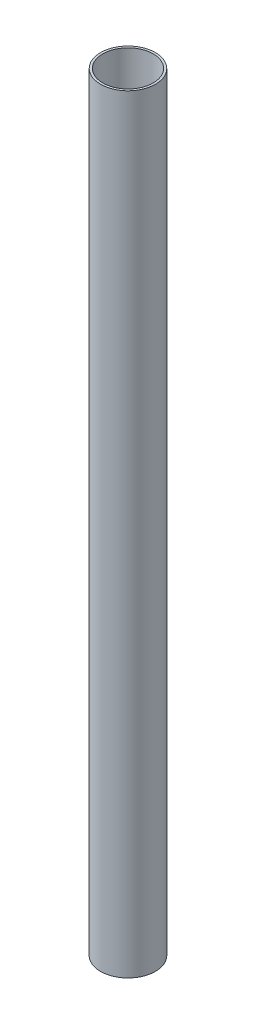
ISO-10303-21;
HEADER;
FILE_DESCRIPTION(('STEP AP214'),'2;1');
FILE_NAME('part.step','',(''),(''),'','','');
FILE_SCHEMA(('AUTOMOTIVE_DESIGN { 1 0 10303 214 1 1 1 1 }'));
ENDSEC;
DATA;
#1=APPLICATION_CONTEXT('core data for automotive mechanical design processes');
#2=APPLICATION_PROTOCOL_DEFINITION('international standard','automotive_design',2000,#1);
#3=PRODUCT_CONTEXT('',#1,'mechanical');
#4=PRODUCT('Part','Part','',(#3));
#5=PRODUCT_RELATED_PRODUCT_CATEGORY('part','',(#4));
#6=PRODUCT_DEFINITION_FORMATION('','',#4);
#7=PRODUCT_DEFINITION_CONTEXT('part definition',#1,'design');
#8=PRODUCT_DEFINITION('design','',#6,#7);
#9=PRODUCT_DEFINITION_SHAPE('','',#8);
#10=(LENGTH_UNIT() NAMED_UNIT(*) SI_UNIT(.MILLI.,.METRE.));
#11=(NAMED_UNIT(*) PLANE_ANGLE_UNIT() SI_UNIT($,.RADIAN.));
#12=(NAMED_UNIT(*) SI_UNIT($,.STERADIAN.) SOLID_ANGLE_UNIT());
#13=UNCERTAINTY_MEASURE_WITH_UNIT(LENGTH_MEASURE(1.E-05),#10,'distance_accuracy_value','');
#14=(GEOMETRIC_REPRESENTATION_CONTEXT(3) GLOBAL_UNCERTAINTY_ASSIGNED_CONTEXT((#13)) GLOBAL_UNIT_ASSIGNED_CONTEXT((#10,
#11,#12)) REPRESENTATION_CONTEXT('',''));
#15=CARTESIAN_POINT('',(0.,0.,0.));
#16=DIRECTION('',(0.,0.,1.));
#17=DIRECTION('',(1.,0.,0.));
#18=AXIS2_PLACEMENT_3D('',#15,#16,#17);
#19=CARTESIAN_POINT('',(0.,350.,0.));
#20=DIRECTION('',(0.,1.,0.));
#21=DIRECTION('',(0.,0.,1.));
#22=AXIS2_PLACEMENT_3D('',#19,#20,#21);
#23=PLANE('',#22);
#24=CARTESIAN_POINT('',(0.,350.,0.));
#25=DIRECTION('',(0.,1.,0.));
#26=DIRECTION('',(0.,0.,1.));
#27=AXIS2_PLACEMENT_3D('',#24,#25,#26);
#28=CIRCLE('',#27,12.5);
#29=CARTESIAN_POINT('',(0.,350.,12.5));
#30=VERTEX_POINT('',#29);
#31=EDGE_CURVE('E10',#30,#30,#28,.T.);
#32=ORIENTED_EDGE('',*,*,#31,.T.);
#33=EDGE_LOOP('',(#32));
#34=FACE_BOUND('',#33,.T.);
#35=CARTESIAN_POINT('',(0.,350.,0.));
#36=DIRECTION('',(0.,1.,0.));
#37=DIRECTION('',(0.,0.,1.));
#38=AXIS2_PLACEMENT_3D('',#35,#36,#37);
#39=CIRCLE('',#38,11.5);
#40=CARTESIAN_POINT('',(0.,350.,11.5));
#41=VERTEX_POINT('',#40);
#42=EDGE_CURVE('E50',#41,#41,#39,.T.);
#43=ORIENTED_EDGE('',*,*,#42,.F.);
#44=EDGE_LOOP('',(#43));
#45=FACE_BOUND('',#44,.T.);
#46=ADVANCED_FACE('F39',(#34,#45),#23,.T.);
#47=CARTESIAN_POINT('',(0.,0.,0.));
#48=DIRECTION('',(0.,1.,0.));
#49=DIRECTION('',(0.,0.,1.));
#50=AXIS2_PLACEMENT_3D('',#47,#48,#49);
#51=PLANE('',#50);
#52=CARTESIAN_POINT('',(0.,0.,0.));
#53=DIRECTION('',(0.,1.,0.));
#54=DIRECTION('',(0.,0.,1.));
#55=AXIS2_PLACEMENT_3D('',#52,#53,#54);
#56=CIRCLE('',#55,12.5);
#57=CARTESIAN_POINT('',(0.,0.,12.5));
#58=VERTEX_POINT('',#57);
#59=EDGE_CURVE('E43',#58,#58,#56,.T.);
#60=ORIENTED_EDGE('',*,*,#59,.F.);
#61=EDGE_LOOP('',(#60));
#62=FACE_BOUND('',#61,.T.);
#63=CARTESIAN_POINT('',(0.,0.,0.));
#64=DIRECTION('',(0.,1.,0.));
#65=DIRECTION('',(0.,0.,1.));
#66=AXIS2_PLACEMENT_3D('',#63,#64,#65);
#67=CIRCLE('',#66,11.5);
#68=CARTESIAN_POINT('',(0.,0.,11.5));
#69=VERTEX_POINT('',#68);
#70=EDGE_CURVE('E52',#69,#69,#67,.T.);
#71=ORIENTED_EDGE('',*,*,#70,.T.);
#72=EDGE_LOOP('',(#71));
#73=FACE_BOUND('',#72,.T.);
#74=ADVANCED_FACE('F62',(#62,#73),#51,.F.);
#75=CARTESIAN_POINT('',(0.,350.,0.));
#76=DIRECTION('',(0.,-1.,0.));
#77=DIRECTION('',(0.,0.,-1.));
#78=AXIS2_PLACEMENT_3D('',#75,#76,#77);
#79=CYLINDRICAL_SURFACE('',#78,12.5);
#80=ORIENTED_EDGE('',*,*,#31,.F.);
#81=EDGE_LOOP('',(#80));
#82=FACE_BOUND('',#81,.T.);
#83=ORIENTED_EDGE('',*,*,#59,.T.);
#84=EDGE_LOOP('',(#83));
#85=FACE_BOUND('',#84,.T.);
#86=ADVANCED_FACE('F41',(#82,#85),#79,.T.);
#87=CARTESIAN_POINT('',(0.,350.,0.));
#88=DIRECTION('',(0.,-1.,0.));
#89=DIRECTION('',(0.,0.,-1.));
#90=AXIS2_PLACEMENT_3D('',#87,#88,#89);
#91=CYLINDRICAL_SURFACE('',#90,11.5);
#92=ORIENTED_EDGE('',*,*,#42,.T.);
#93=EDGE_LOOP('',(#92));
#94=FACE_BOUND('',#93,.T.);
#95=ORIENTED_EDGE('',*,*,#70,.F.);
#96=EDGE_LOOP('',(#95));
#97=FACE_BOUND('',#96,.T.);
#98=ADVANCED_FACE('F58',(#94,#97),#91,.F.);
#99=CLOSED_SHELL('',(#46,#74,#86,#98));
#100=MANIFOLD_SOLID_BREP('B2',#99);
#101=ADVANCED_BREP_SHAPE_REPRESENTATION('',(#18,#100),#14);
#102=SHAPE_DEFINITION_REPRESENTATION(#9,#101);
ENDSEC;
END-ISO-10303-21;
